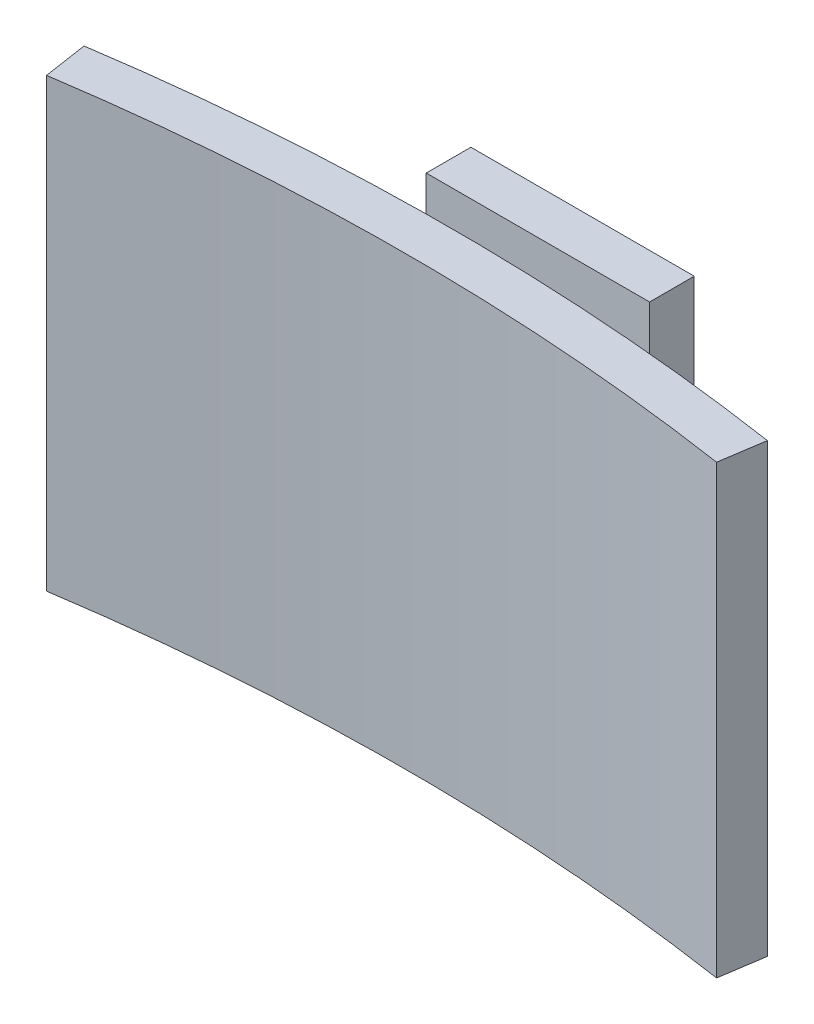
ISO-10303-21;
HEADER;
FILE_DESCRIPTION(('STEP AP214'),'2;1');
FILE_NAME('part.step','',(''),(''),'','','');
FILE_SCHEMA(('AUTOMOTIVE_DESIGN { 1 0 10303 214 1 1 1 1 }'));
ENDSEC;
DATA;
#1=APPLICATION_CONTEXT('core data for automotive mechanical design processes');
#2=APPLICATION_PROTOCOL_DEFINITION('international standard','automotive_design',2000,#1);
#3=PRODUCT_CONTEXT('',#1,'mechanical');
#4=PRODUCT('Part','Part','',(#3));
#5=PRODUCT_RELATED_PRODUCT_CATEGORY('part','',(#4));
#6=PRODUCT_DEFINITION_FORMATION('','',#4);
#7=PRODUCT_DEFINITION_CONTEXT('part definition',#1,'design');
#8=PRODUCT_DEFINITION('design','',#6,#7);
#9=PRODUCT_DEFINITION_SHAPE('','',#8);
#10=(LENGTH_UNIT() NAMED_UNIT(*) SI_UNIT(.MILLI.,.METRE.));
#11=(NAMED_UNIT(*) PLANE_ANGLE_UNIT() SI_UNIT($,.RADIAN.));
#12=(NAMED_UNIT(*) SI_UNIT($,.STERADIAN.) SOLID_ANGLE_UNIT());
#13=UNCERTAINTY_MEASURE_WITH_UNIT(LENGTH_MEASURE(1.E-05),#10,'distance_accuracy_value','');
#14=(GEOMETRIC_REPRESENTATION_CONTEXT(3) GLOBAL_UNCERTAINTY_ASSIGNED_CONTEXT((#13)) GLOBAL_UNIT_ASSIGNED_CONTEXT((#10,
#11,#12)) REPRESENTATION_CONTEXT('',''));
#15=CARTESIAN_POINT('',(0.,0.,0.));
#16=DIRECTION('',(0.,0.,1.));
#17=DIRECTION('',(1.,0.,0.));
#18=AXIS2_PLACEMENT_3D('',#15,#16,#17);
#19=CARTESIAN_POINT('',(-5.,17.7131373956197,-7.));
#20=DIRECTION('',(0.,0.,-1.));
#21=DIRECTION('',(-1.,0.,0.));
#22=AXIS2_PLACEMENT_3D('',#19,#20,#21);
#23=PLANE('',#22);
#24=DIRECTION('',(0.,-1.,0.));
#25=VECTOR('',#24,1.);
#26=CARTESIAN_POINT('',(-5.,17.7131373956197,-7.));
#27=LINE('',#26,#25);
#28=CARTESIAN_POINT('',(-5.,17.7131373956197,-7.));
#29=VERTEX_POINT('',#28);
#30=CARTESIAN_POINT('',(-5.,13.4131373956197,-7.));
#31=VERTEX_POINT('',#30);
#32=EDGE_CURVE('E187',#29,#31,#27,.T.);
#33=ORIENTED_EDGE('',*,*,#32,.T.);
#34=DIRECTION('',(1.,0.,0.));
#35=VECTOR('',#34,1.);
#36=CARTESIAN_POINT('',(-5.,13.4131373956197,-7.));
#37=LINE('',#36,#35);
#38=CARTESIAN_POINT('',(5.,13.4131373956197,-7.));
#39=VERTEX_POINT('',#38);
#40=EDGE_CURVE('E11',#31,#39,#37,.T.);
#41=ORIENTED_EDGE('',*,*,#40,.T.);
#42=DIRECTION('',(0.,-1.,0.));
#43=VECTOR('',#42,1.);
#44=CARTESIAN_POINT('',(5.,17.7131373956197,-7.));
#45=LINE('',#44,#43);
#46=CARTESIAN_POINT('',(5.,17.7131373956197,-7.));
#47=VERTEX_POINT('',#46);
#48=EDGE_CURVE('E48',#47,#39,#45,.T.);
#49=ORIENTED_EDGE('',*,*,#48,.F.);
#50=DIRECTION('',(1.,0.,0.));
#51=VECTOR('',#50,1.);
#52=CARTESIAN_POINT('',(-5.,17.7131373956197,-7.));
#53=LINE('',#52,#51);
#54=EDGE_CURVE('E177',#29,#47,#53,.T.);
#55=ORIENTED_EDGE('',*,*,#54,.F.);
#56=EDGE_LOOP('',(#33,#41,#49,#55));
#57=FACE_BOUND('',#56,.T.);
#58=ADVANCED_FACE('F33',(#57),#23,.F.);
#59=DIRECTION('',(1.,0.,0.));
#60=VECTOR('',#59,1.);
#61=CARTESIAN_POINT('',(5.,12.7131373956197,-7.));
#62=LINE('',#61,#60);
#63=CARTESIAN_POINT('',(-5.,12.7131373956197,-7.));
#64=VERTEX_POINT('',#63);
#65=CARTESIAN_POINT('',(5.,12.7131373956197,-7.));
#66=VERTEX_POINT('',#65);
#67=EDGE_CURVE('E173',#64,#66,#62,.T.);
#68=ORIENTED_EDGE('',*,*,#67,.F.);
#69=CARTESIAN_POINT('',(-5.,10.7131373956197,-7.));
#70=VERTEX_POINT('',#69);
#71=EDGE_CURVE('E160',#64,#70,#27,.T.);
#72=ORIENTED_EDGE('',*,*,#71,.T.);
#73=DIRECTION('',(1.,0.,0.));
#74=VECTOR('',#73,1.);
#75=CARTESIAN_POINT('',(5.,10.7131373956197,-7.));
#76=LINE('',#75,#74);
#77=CARTESIAN_POINT('',(5.,10.7131373956197,-7.));
#78=VERTEX_POINT('',#77);
#79=EDGE_CURVE('E244',#70,#78,#76,.T.);
#80=ORIENTED_EDGE('',*,*,#79,.T.);
#81=EDGE_CURVE('E185',#66,#78,#45,.T.);
#82=ORIENTED_EDGE('',*,*,#81,.F.);
#83=EDGE_LOOP('',(#68,#72,#80,#82));
#84=FACE_BOUND('',#83,.T.);
#85=ADVANCED_FACE('F303',(#84),#23,.F.);
#86=CARTESIAN_POINT('',(-5.,7.71313739561969,0.000999999999997531));
#87=DIRECTION('',(0.,-1.,0.));
#88=DIRECTION('',(1.,0.,0.));
#89=AXIS2_PLACEMENT_3D('',#86,#87,#88);
#90=PLANE('',#89);
#91=DIRECTION('',(0.,0.,-1.));
#92=VECTOR('',#91,1.);
#93=CARTESIAN_POINT('',(5.,7.71313739561969,0.000999999999997531));
#94=LINE('',#93,#92);
#95=CARTESIAN_POINT('',(5.,7.71313739561969,-3.00877760645049));
#96=VERTEX_POINT('',#95);
#97=CARTESIAN_POINT('',(5.,7.71313739561969,-5.26794919243111));
#98=VERTEX_POINT('',#97);
#99=EDGE_CURVE('E193',#96,#98,#94,.T.);
#100=ORIENTED_EDGE('',*,*,#99,.T.);
#101=DIRECTION('',(-1.,0.,0.));
#102=VECTOR('',#101,1.);
#103=CARTESIAN_POINT('',(-5.,7.71313739561969,-5.26794919243111));
#104=LINE('',#103,#102);
#105=CARTESIAN_POINT('',(-5.,7.71313739561969,-5.26794919243111));
#106=VERTEX_POINT('',#105);
#107=EDGE_CURVE('E247',#98,#106,#104,.T.);
#108=ORIENTED_EDGE('',*,*,#107,.T.);
#109=DIRECTION('',(0.,0.,-1.));
#110=VECTOR('',#109,1.);
#111=CARTESIAN_POINT('',(-5.,7.71313739561969,0.000999999999997531));
#112=LINE('',#111,#110);
#113=CARTESIAN_POINT('',(-5.,7.71313739561969,-3.00877760645049));
#114=VERTEX_POINT('',#113);
#115=EDGE_CURVE('E208',#114,#106,#112,.T.);
#116=ORIENTED_EDGE('',*,*,#115,.F.);
#117=CARTESIAN_POINT('',(0.,7.71313739561969,98.868599666426));
#118=DIRECTION('',(0.,-1.,0.));
#119=DIRECTION('',(1.,0.,0.));
#120=AXIS2_PLACEMENT_3D('',#117,#118,#119);
#121=CIRCLE('',#120,102.);
#122=EDGE_CURVE('E192',#96,#114,#121,.F.);
#123=ORIENTED_EDGE('',*,*,#122,.F.);
#124=EDGE_LOOP('',(#100,#108,#116,#123));
#125=FACE_BOUND('',#124,.T.);
#126=ADVANCED_FACE('F295',(#125),#90,.F.);
#127=CARTESIAN_POINT('',(0.,20.,98.868599666426));
#128=DIRECTION('',(0.,-1.,0.));
#129=DIRECTION('',(0.,0.,-1.));
#130=AXIS2_PLACEMENT_3D('',#127,#128,#129);
#131=CYLINDRICAL_SURFACE('',#130,102.);
#132=CARTESIAN_POINT('',(0.,0.,98.868599666426));
#133=DIRECTION('',(0.,1.,0.));
#134=DIRECTION('',(0.,0.,-1.));
#135=AXIS2_PLACEMENT_3D('',#132,#133,#134);
#136=CIRCLE('',#135,102.);
#137=CARTESIAN_POINT('',(15.3,0.,-1.97737199332854));
#138=VERTEX_POINT('',#137);
#139=CARTESIAN_POINT('',(-15.3,0.,-1.97737199332852));
#140=VERTEX_POINT('',#139);
#141=EDGE_CURVE('E230',#138,#140,#136,.T.);
#142=ORIENTED_EDGE('',*,*,#141,.T.);
#143=DIRECTION('',(0.,-1.,0.));
#144=VECTOR('',#143,1.);
#145=CARTESIAN_POINT('',(-15.3,20.,-1.97737199332852));
#146=LINE('',#145,#144);
#147=CARTESIAN_POINT('',(-15.3,20.,-1.97737199332852));
#148=VERTEX_POINT('',#147);
#149=EDGE_CURVE('E235',#148,#140,#146,.T.);
#150=ORIENTED_EDGE('',*,*,#149,.F.);
#151=CARTESIAN_POINT('',(0.,20.,98.868599666426));
#152=DIRECTION('',(0.,1.,0.));
#153=DIRECTION('',(0.,0.,-1.));
#154=AXIS2_PLACEMENT_3D('',#151,#152,#153);
#155=CIRCLE('',#154,102.);
#156=CARTESIAN_POINT('',(15.3,20.,-1.97737199332854));
#157=VERTEX_POINT('',#156);
#158=EDGE_CURVE('E221',#157,#148,#155,.T.);
#159=ORIENTED_EDGE('',*,*,#158,.F.);
#160=DIRECTION('',(0.,-1.,0.));
#161=VECTOR('',#160,1.);
#162=CARTESIAN_POINT('',(15.3,20.,-1.97737199332854));
#163=LINE('',#162,#161);
#164=EDGE_CURVE('E238',#157,#138,#163,.T.);
#165=ORIENTED_EDGE('',*,*,#164,.T.);
#166=EDGE_LOOP('',(#142,#150,#159,#165));
#167=FACE_BOUND('',#166,.T.);
#168=DIRECTION('',(0.,-1.,0.));
#169=VECTOR('',#168,1.);
#170=CARTESIAN_POINT('',(5.,20.,-3.00877760645049));
#171=LINE('',#170,#169);
#172=CARTESIAN_POINT('',(5.,5.21313739561969,-3.00877760645049));
#173=VERTEX_POINT('',#172);
#174=EDGE_CURVE('E195',#173,#96,#171,.F.);
#175=ORIENTED_EDGE('',*,*,#174,.T.);
#176=ORIENTED_EDGE('',*,*,#122,.T.);
#177=DIRECTION('',(0.,-1.,0.));
#178=VECTOR('',#177,1.);
#179=CARTESIAN_POINT('',(-5.,20.,-3.00877760645049));
#180=LINE('',#179,#178);
#181=CARTESIAN_POINT('',(-5.,5.21313739561969,-3.00877760645049));
#182=VERTEX_POINT('',#181);
#183=EDGE_CURVE('E190',#114,#182,#180,.T.);
#184=ORIENTED_EDGE('',*,*,#183,.T.);
#185=CARTESIAN_POINT('',(0.,5.21313739561969,98.868599666426));
#186=DIRECTION('',(0.,1.,0.));
#187=DIRECTION('',(-1.,0.,0.));
#188=AXIS2_PLACEMENT_3D('',#185,#186,#187);
#189=CIRCLE('',#188,102.);
#190=EDGE_CURVE('E197',#182,#173,#189,.F.);
#191=ORIENTED_EDGE('',*,*,#190,.T.);
#192=EDGE_LOOP('',(#175,#176,#184,#191));
#193=FACE_BOUND('',#192,.T.);
#194=ADVANCED_FACE('F291',(#167,#193),#131,.T.);
#195=CARTESIAN_POINT('',(0.,20.,98.868599666426));
#196=DIRECTION('',(0.,-1.,0.));
#197=DIRECTION('',(0.,0.,-1.));
#198=AXIS2_PLACEMENT_3D('',#195,#196,#197);
#199=CYLINDRICAL_SURFACE('',#198,100.);
#200=CARTESIAN_POINT('',(0.,0.,98.868599666426));
#201=DIRECTION('',(0.,-1.,0.));
#202=DIRECTION('',(0.,0.,-1.));
#203=AXIS2_PLACEMENT_3D('',#200,#201,#202);
#204=CIRCLE('',#203,100.);
#205=CARTESIAN_POINT('',(-15.,0.,0.));
#206=VERTEX_POINT('',#205);
#207=CARTESIAN_POINT('',(15.,0.,0.));
#208=VERTEX_POINT('',#207);
#209=EDGE_CURVE('E214',#206,#208,#204,.T.);
#210=ORIENTED_EDGE('',*,*,#209,.T.);
#211=DIRECTION('',(0.,-1.,0.));
#212=VECTOR('',#211,1.);
#213=CARTESIAN_POINT('',(15.,20.,0.));
#214=LINE('',#213,#212);
#215=CARTESIAN_POINT('',(15.,20.,0.));
#216=VERTEX_POINT('',#215);
#217=EDGE_CURVE('E241',#216,#208,#214,.T.);
#218=ORIENTED_EDGE('',*,*,#217,.F.);
#219=CARTESIAN_POINT('',(0.,20.,98.868599666426));
#220=DIRECTION('',(0.,-1.,0.));
#221=DIRECTION('',(0.,0.,-1.));
#222=AXIS2_PLACEMENT_3D('',#219,#220,#221);
#223=CIRCLE('',#222,100.);
#224=CARTESIAN_POINT('',(-15.,20.,0.));
#225=VERTEX_POINT('',#224);
#226=EDGE_CURVE('E215',#225,#216,#223,.T.);
#227=ORIENTED_EDGE('',*,*,#226,.F.);
#228=DIRECTION('',(0.,-1.,0.));
#229=VECTOR('',#228,1.);
#230=CARTESIAN_POINT('',(-15.,20.,0.));
#231=LINE('',#230,#229);
#232=EDGE_CURVE('E225',#225,#206,#231,.T.);
#233=ORIENTED_EDGE('',*,*,#232,.T.);
#234=EDGE_LOOP('',(#210,#218,#227,#233));
#235=FACE_BOUND('',#234,.T.);
#236=ADVANCED_FACE('F337',(#235),#199,.F.);
#237=CARTESIAN_POINT('',(15.,20.,0.));
#238=DIRECTION('',(-0.98868599666426,0.,-0.149999999999994));
#239=DIRECTION('',(-0.149999999999994,0.,0.98868599666426));
#240=AXIS2_PLACEMENT_3D('',#237,#238,#239);
#241=PLANE('',#240);
#242=DIRECTION('',(0.149999999999994,0.,-0.98868599666426));
#243=VECTOR('',#242,1.);
#244=CARTESIAN_POINT('',(15.,0.,0.));
#245=LINE('',#244,#243);
#246=EDGE_CURVE('E228',#208,#138,#245,.T.);
#247=ORIENTED_EDGE('',*,*,#246,.T.);
#248=ORIENTED_EDGE('',*,*,#164,.F.);
#249=DIRECTION('',(0.149999999999994,0.,-0.98868599666426));
#250=VECTOR('',#249,1.);
#251=CARTESIAN_POINT('',(15.,20.,0.));
#252=LINE('',#251,#250);
#253=EDGE_CURVE('E218',#216,#157,#252,.T.);
#254=ORIENTED_EDGE('',*,*,#253,.F.);
#255=ORIENTED_EDGE('',*,*,#217,.T.);
#256=EDGE_LOOP('',(#247,#248,#254,#255));
#257=FACE_BOUND('',#256,.T.);
#258=ADVANCED_FACE('F333',(#257),#241,.F.);
#259=CARTESIAN_POINT('',(-15.3,20.,-1.97737199332852));
#260=DIRECTION('',(0.98868599666426,0.,-0.149999999999998));
#261=DIRECTION('',(-0.149999999999998,0.,-0.98868599666426));
#262=AXIS2_PLACEMENT_3D('',#259,#260,#261);
#263=PLANE('',#262);
#264=DIRECTION('',(0.149999999999998,0.,0.98868599666426));
#265=VECTOR('',#264,1.);
#266=CARTESIAN_POINT('',(-15.3,0.,-1.97737199332852));
#267=LINE('',#266,#265);
#268=EDGE_CURVE('E219',#140,#206,#267,.T.);
#269=ORIENTED_EDGE('',*,*,#268,.T.);
#270=ORIENTED_EDGE('',*,*,#232,.F.);
#271=DIRECTION('',(0.149999999999998,0.,0.98868599666426));
#272=VECTOR('',#271,1.);
#273=CARTESIAN_POINT('',(-15.3,20.,-1.97737199332852));
#274=LINE('',#273,#272);
#275=EDGE_CURVE('E223',#148,#225,#274,.T.);
#276=ORIENTED_EDGE('',*,*,#275,.F.);
#277=ORIENTED_EDGE('',*,*,#149,.T.);
#278=EDGE_LOOP('',(#269,#270,#276,#277));
#279=FACE_BOUND('',#278,.T.);
#280=ADVANCED_FACE('F326',(#279),#263,.F.);
#281=CARTESIAN_POINT('',(0.,20.,98.868599666426));
#282=DIRECTION('',(0.,-1.,0.));
#283=DIRECTION('',(0.,0.,-1.));
#284=AXIS2_PLACEMENT_3D('',#281,#282,#283);
#285=PLANE('',#284);
#286=ORIENTED_EDGE('',*,*,#226,.T.);
#287=ORIENTED_EDGE('',*,*,#253,.T.);
#288=ORIENTED_EDGE('',*,*,#158,.T.);
#289=ORIENTED_EDGE('',*,*,#275,.T.);
#290=EDGE_LOOP('',(#286,#287,#288,#289));
#291=FACE_BOUND('',#290,.T.);
#292=ADVANCED_FACE('F323',(#291),#285,.F.);
#293=CARTESIAN_POINT('',(0.,0.,98.868599666426));
#294=DIRECTION('',(0.,-1.,0.));
#295=DIRECTION('',(0.,0.,-1.));
#296=AXIS2_PLACEMENT_3D('',#293,#294,#295);
#297=PLANE('',#296);
#298=ORIENTED_EDGE('',*,*,#209,.F.);
#299=ORIENTED_EDGE('',*,*,#268,.F.);
#300=ORIENTED_EDGE('',*,*,#141,.F.);
#301=ORIENTED_EDGE('',*,*,#246,.F.);
#302=EDGE_LOOP('',(#298,#299,#300,#301));
#303=FACE_BOUND('',#302,.T.);
#304=ADVANCED_FACE('F322',(#303),#297,.T.);
#305=CARTESIAN_POINT('',(5.,5.21313739561969,0.000999999999997531));
#306=DIRECTION('',(-1.,0.,0.));
#307=DIRECTION('',(0.,0.,1.));
#308=AXIS2_PLACEMENT_3D('',#305,#306,#307);
#309=PLANE('',#308);
#310=ORIENTED_EDGE('',*,*,#48,.T.);
#311=DIRECTION('',(0.,-0.707106781186551,0.707106781186544));
#312=VECTOR('',#311,1.);
#313=CARTESIAN_POINT('',(5.,13.2131373956197,-6.8));
#314=LINE('',#313,#312);
#315=CARTESIAN_POINT('',(5.,13.2131373956197,-6.8));
#316=VERTEX_POINT('',#315);
#317=EDGE_CURVE('E42',#39,#316,#314,.T.);
#318=ORIENTED_EDGE('',*,*,#317,.T.);
#319=DIRECTION('',(0.,1.,0.));
#320=VECTOR('',#319,1.);
#321=CARTESIAN_POINT('',(5.,12.7131373956197,-6.8));
#322=LINE('',#321,#320);
#323=CARTESIAN_POINT('',(5.,12.7131373956197,-6.8));
#324=VERTEX_POINT('',#323);
#325=EDGE_CURVE('E153',#324,#316,#322,.T.);
#326=ORIENTED_EDGE('',*,*,#325,.F.);
#327=DIRECTION('',(0.,0.,-1.));
#328=VECTOR('',#327,1.);
#329=CARTESIAN_POINT('',(5.,12.7131373956197,-6.8));
#330=LINE('',#329,#328);
#331=EDGE_CURVE('E164',#324,#66,#330,.T.);
#332=ORIENTED_EDGE('',*,*,#331,.T.);
#333=ORIENTED_EDGE('',*,*,#81,.T.);
#334=DIRECTION('',(0.,0.866025403784436,-0.500000000000004));
#335=VECTOR('',#334,1.);
#336=CARTESIAN_POINT('',(5.,3.55661546967227,-2.86818013959276));
#337=LINE('',#336,#335);
#338=EDGE_CURVE('E249',#78,#98,#337,.F.);
#339=ORIENTED_EDGE('',*,*,#338,.T.);
#340=ORIENTED_EDGE('',*,*,#99,.F.);
#341=ORIENTED_EDGE('',*,*,#174,.F.);
#342=DIRECTION('',(0.,0.,-1.));
#343=VECTOR('',#342,1.);
#344=CARTESIAN_POINT('',(5.,5.21313739561969,0.000999999999997531));
#345=LINE('',#344,#343);
#346=CARTESIAN_POINT('',(5.,5.21313739561969,-6.69059892324149));
#347=VERTEX_POINT('',#346);
#348=EDGE_CURVE('E202',#173,#347,#345,.T.);
#349=ORIENTED_EDGE('',*,*,#348,.T.);
#350=DIRECTION('',(0.,0.86602540378444,-0.499999999999998));
#351=VECTOR('',#350,1.);
#352=CARTESIAN_POINT('',(5.,5.21313739561969,-6.69059892324149));
#353=LINE('',#352,#351);
#354=CARTESIAN_POINT('',(5.,9.21313739561972,-9.));
#355=VERTEX_POINT('',#354);
#356=EDGE_CURVE('E256',#347,#355,#353,.T.);
#357=ORIENTED_EDGE('',*,*,#356,.T.);
#358=DIRECTION('',(0.,1.,0.));
#359=VECTOR('',#358,1.);
#360=CARTESIAN_POINT('',(5.,5.21313739561969,-9.));
#361=LINE('',#360,#359);
#362=CARTESIAN_POINT('',(5.,17.7131373956197,-9.));
#363=VERTEX_POINT('',#362);
#364=EDGE_CURVE('E189',#355,#363,#361,.T.);
#365=ORIENTED_EDGE('',*,*,#364,.T.);
#366=DIRECTION('',(0.,0.,-1.));
#367=VECTOR('',#366,1.);
#368=CARTESIAN_POINT('',(5.,17.7131373956197,-9.));
#369=LINE('',#368,#367);
#370=EDGE_CURVE('E179',#47,#363,#369,.T.);
#371=ORIENTED_EDGE('',*,*,#370,.F.);
#372=EDGE_LOOP('',(#310,#318,#326,#332,#333,#339,#340,#341,#349,#357,#365,#371));
#373=FACE_BOUND('',#372,.T.);
#374=ADVANCED_FACE('F265',(#373),#309,.F.);
#375=CARTESIAN_POINT('',(-5.,5.21313739561969,0.000999999999997531));
#376=DIRECTION('',(1.,0.,0.));
#377=DIRECTION('',(0.,0.,-1.));
#378=AXIS2_PLACEMENT_3D('',#375,#376,#377);
#379=PLANE('',#378);
#380=DIRECTION('',(0.,0.707106781186551,-0.707106781186544));
#381=VECTOR('',#380,1.);
#382=CARTESIAN_POINT('',(-5.,13.2131373956197,-6.8));
#383=LINE('',#382,#381);
#384=CARTESIAN_POINT('',(-5.,13.2131373956197,-6.8));
#385=VERTEX_POINT('',#384);
#386=EDGE_CURVE('E263',#385,#31,#383,.T.);
#387=ORIENTED_EDGE('',*,*,#386,.T.);
#388=ORIENTED_EDGE('',*,*,#32,.F.);
#389=DIRECTION('',(0.,0.,1.));
#390=VECTOR('',#389,1.);
#391=CARTESIAN_POINT('',(-5.,17.7131373956197,-9.));
#392=LINE('',#391,#390);
#393=CARTESIAN_POINT('',(-5.,17.7131373956197,-9.));
#394=VERTEX_POINT('',#393);
#395=EDGE_CURVE('E163',#394,#29,#392,.T.);
#396=ORIENTED_EDGE('',*,*,#395,.F.);
#397=DIRECTION('',(0.,-1.,0.));
#398=VECTOR('',#397,1.);
#399=CARTESIAN_POINT('',(-5.,5.21313739561969,-9.));
#400=LINE('',#399,#398);
#401=CARTESIAN_POINT('',(-5.,9.21313739561972,-9.));
#402=VERTEX_POINT('',#401);
#403=EDGE_CURVE('E199',#394,#402,#400,.T.);
#404=ORIENTED_EDGE('',*,*,#403,.T.);
#405=DIRECTION('',(0.,-0.86602540378444,0.499999999999998));
#406=VECTOR('',#405,1.);
#407=CARTESIAN_POINT('',(-5.,5.21313739561969,-6.69059892324149));
#408=LINE('',#407,#406);
#409=CARTESIAN_POINT('',(-5.,5.21313739561969,-6.69059892324149));
#410=VERTEX_POINT('',#409);
#411=EDGE_CURVE('E260',#402,#410,#408,.T.);
#412=ORIENTED_EDGE('',*,*,#411,.T.);
#413=DIRECTION('',(0.,0.,-1.));
#414=VECTOR('',#413,1.);
#415=CARTESIAN_POINT('',(-5.,5.21313739561969,0.000999999999997531));
#416=LINE('',#415,#414);
#417=EDGE_CURVE('E205',#182,#410,#416,.T.);
#418=ORIENTED_EDGE('',*,*,#417,.F.);
#419=ORIENTED_EDGE('',*,*,#183,.F.);
#420=ORIENTED_EDGE('',*,*,#115,.T.);
#421=DIRECTION('',(0.,-0.866025403784436,0.500000000000004));
#422=VECTOR('',#421,1.);
#423=CARTESIAN_POINT('',(-5.,3.55661546967227,-2.86818013959276));
#424=LINE('',#423,#422);
#425=EDGE_CURVE('E251',#106,#70,#424,.F.);
#426=ORIENTED_EDGE('',*,*,#425,.T.);
#427=ORIENTED_EDGE('',*,*,#71,.F.);
#428=DIRECTION('',(0.,0.,-1.));
#429=VECTOR('',#428,1.);
#430=CARTESIAN_POINT('',(-5.,12.7131373956197,-6.8));
#431=LINE('',#430,#429);
#432=CARTESIAN_POINT('',(-5.,12.7131373956197,-6.8));
#433=VERTEX_POINT('',#432);
#434=EDGE_CURVE('E157',#433,#64,#431,.T.);
#435=ORIENTED_EDGE('',*,*,#434,.F.);
#436=DIRECTION('',(0.,-1.,0.));
#437=VECTOR('',#436,1.);
#438=CARTESIAN_POINT('',(-5.,12.7131373956197,-6.8));
#439=LINE('',#438,#437);
#440=EDGE_CURVE('E142',#385,#433,#439,.T.);
#441=ORIENTED_EDGE('',*,*,#440,.F.);
#442=EDGE_LOOP('',(#387,#388,#396,#404,#412,#418,#419,#420,#426,#427,#435,#441));
#443=FACE_BOUND('',#442,.T.);
#444=ADVANCED_FACE('F158',(#443),#379,.F.);
#445=CARTESIAN_POINT('',(-5.,5.21313739561969,0.000999999999997531));
#446=DIRECTION('',(0.,1.,0.));
#447=DIRECTION('',(-1.,0.,0.));
#448=AXIS2_PLACEMENT_3D('',#445,#446,#447);
#449=PLANE('',#448);
#450=ORIENTED_EDGE('',*,*,#417,.T.);
#451=DIRECTION('',(1.,0.,0.));
#452=VECTOR('',#451,1.);
#453=CARTESIAN_POINT('',(5.,5.21313739561969,-6.69059892324149));
#454=LINE('',#453,#452);
#455=EDGE_CURVE('E253',#410,#347,#454,.T.);
#456=ORIENTED_EDGE('',*,*,#455,.T.);
#457=ORIENTED_EDGE('',*,*,#348,.F.);
#458=ORIENTED_EDGE('',*,*,#190,.F.);
#459=EDGE_LOOP('',(#450,#456,#457,#458));
#460=FACE_BOUND('',#459,.T.);
#461=ADVANCED_FACE('F285',(#460),#449,.F.);
#462=CARTESIAN_POINT('',(0.,0.,-9.));
#463=DIRECTION('',(0.,0.,-1.));
#464=DIRECTION('',(-1.,0.,0.));
#465=AXIS2_PLACEMENT_3D('',#462,#463,#464);
#466=PLANE('',#465);
#467=ORIENTED_EDGE('',*,*,#364,.F.);
#468=DIRECTION('',(-1.,0.,0.));
#469=VECTOR('',#468,1.);
#470=CARTESIAN_POINT('',(-5.,9.21313739561972,-9.));
#471=LINE('',#470,#469);
#472=EDGE_CURVE('E258',#355,#402,#471,.T.);
#473=ORIENTED_EDGE('',*,*,#472,.T.);
#474=ORIENTED_EDGE('',*,*,#403,.F.);
#475=DIRECTION('',(-1.,0.,0.));
#476=VECTOR('',#475,1.);
#477=CARTESIAN_POINT('',(-5.,17.7131373956197,-9.));
#478=LINE('',#477,#476);
#479=EDGE_CURVE('E182',#363,#394,#478,.T.);
#480=ORIENTED_EDGE('',*,*,#479,.F.);
#481=EDGE_LOOP('',(#467,#473,#474,#480));
#482=FACE_BOUND('',#481,.T.);
#483=ADVANCED_FACE('F276',(#482),#466,.T.);
#484=CARTESIAN_POINT('',(0.,17.7131373956197,0.));
#485=DIRECTION('',(0.,1.,0.));
#486=DIRECTION('',(-1.,0.,0.));
#487=AXIS2_PLACEMENT_3D('',#484,#485,#486);
#488=PLANE('',#487);
#489=ORIENTED_EDGE('',*,*,#395,.T.);
#490=ORIENTED_EDGE('',*,*,#54,.T.);
#491=ORIENTED_EDGE('',*,*,#370,.T.);
#492=ORIENTED_EDGE('',*,*,#479,.T.);
#493=EDGE_LOOP('',(#489,#490,#491,#492));
#494=FACE_BOUND('',#493,.T.);
#495=ADVANCED_FACE('F272',(#494),#488,.T.);
#496=CARTESIAN_POINT('',(-5.,10.7131373956197,-7.));
#497=DIRECTION('',(0.,0.500000000000004,0.866025403784436));
#498=DIRECTION('',(-1.,0.,0.));
#499=AXIS2_PLACEMENT_3D('',#496,#497,#498);
#500=PLANE('',#499);
#501=ORIENTED_EDGE('',*,*,#425,.F.);
#502=ORIENTED_EDGE('',*,*,#107,.F.);
#503=ORIENTED_EDGE('',*,*,#338,.F.);
#504=ORIENTED_EDGE('',*,*,#79,.F.);
#505=EDGE_LOOP('',(#501,#502,#503,#504));
#506=FACE_BOUND('',#505,.T.);
#507=ADVANCED_FACE('F300',(#506),#500,.T.);
#508=CARTESIAN_POINT('',(-5.,5.21313739561969,-6.69059892324149));
#509=DIRECTION('',(0.,-0.499999999999998,-0.86602540378444));
#510=DIRECTION('',(-1.,0.,0.));
#511=AXIS2_PLACEMENT_3D('',#508,#509,#510);
#512=PLANE('',#511);
#513=ORIENTED_EDGE('',*,*,#411,.F.);
#514=ORIENTED_EDGE('',*,*,#472,.F.);
#515=ORIENTED_EDGE('',*,*,#356,.F.);
#516=ORIENTED_EDGE('',*,*,#455,.F.);
#517=EDGE_LOOP('',(#513,#514,#515,#516));
#518=FACE_BOUND('',#517,.T.);
#519=ADVANCED_FACE('F282',(#518),#512,.T.);
#520=CARTESIAN_POINT('',(5.,12.7131373956197,-6.8));
#521=DIRECTION('',(0.,1.,0.));
#522=DIRECTION('',(0.,0.,1.));
#523=AXIS2_PLACEMENT_3D('',#520,#521,#522);
#524=PLANE('',#523);
#525=ORIENTED_EDGE('',*,*,#67,.T.);
#526=ORIENTED_EDGE('',*,*,#331,.F.);
#527=DIRECTION('',(1.,0.,0.));
#528=VECTOR('',#527,1.);
#529=CARTESIAN_POINT('',(5.,12.7131373956197,-6.8));
#530=LINE('',#529,#528);
#531=EDGE_CURVE('E147',#433,#324,#530,.T.);
#532=ORIENTED_EDGE('',*,*,#531,.F.);
#533=ORIENTED_EDGE('',*,*,#434,.T.);
#534=EDGE_LOOP('',(#525,#526,#532,#533));
#535=FACE_BOUND('',#534,.T.);
#536=ADVANCED_FACE('F166',(#535),#524,.F.);
#537=CARTESIAN_POINT('',(0.,0.,-6.8));
#538=DIRECTION('',(0.,0.,1.));
#539=DIRECTION('',(1.,0.,0.));
#540=AXIS2_PLACEMENT_3D('',#537,#538,#539);
#541=PLANE('',#540);
#542=ORIENTED_EDGE('',*,*,#325,.T.);
#543=DIRECTION('',(-1.,0.,0.));
#544=VECTOR('',#543,1.);
#545=CARTESIAN_POINT('',(-5.,13.2131373956197,-6.8));
#546=LINE('',#545,#544);
#547=EDGE_CURVE('E150',#316,#385,#546,.T.);
#548=ORIENTED_EDGE('',*,*,#547,.T.);
#549=ORIENTED_EDGE('',*,*,#440,.T.);
#550=ORIENTED_EDGE('',*,*,#531,.T.);
#551=EDGE_LOOP('',(#542,#548,#549,#550));
#552=FACE_BOUND('',#551,.T.);
#553=ADVANCED_FACE('F145',(#552),#541,.T.);
#554=CARTESIAN_POINT('',(0.,13.2131373956197,-6.8));
#555=DIRECTION('',(0.,0.707106781186544,0.707106781186551));
#556=DIRECTION('',(1.,0.,0.));
#557=AXIS2_PLACEMENT_3D('',#554,#555,#556);
#558=PLANE('',#557);
#559=ORIENTED_EDGE('',*,*,#317,.F.);
#560=ORIENTED_EDGE('',*,*,#40,.F.);
#561=ORIENTED_EDGE('',*,*,#386,.F.);
#562=ORIENTED_EDGE('',*,*,#547,.F.);
#563=EDGE_LOOP('',(#559,#560,#561,#562));
#564=FACE_BOUND('',#563,.T.);
#565=ADVANCED_FACE('F35',(#564),#558,.T.);
#566=CLOSED_SHELL('',(#58,#85,#126,#194,#236,#258,#280,#292,#304,#374,#444,#461,#483,#495,#507,
#519,#536,#553,#565));
#567=MANIFOLD_SOLID_BREP('B2',#566);
#568=ADVANCED_BREP_SHAPE_REPRESENTATION('',(#18,#567),#14);
#569=SHAPE_DEFINITION_REPRESENTATION(#9,#568);
ENDSEC;
END-ISO-10303-21;
